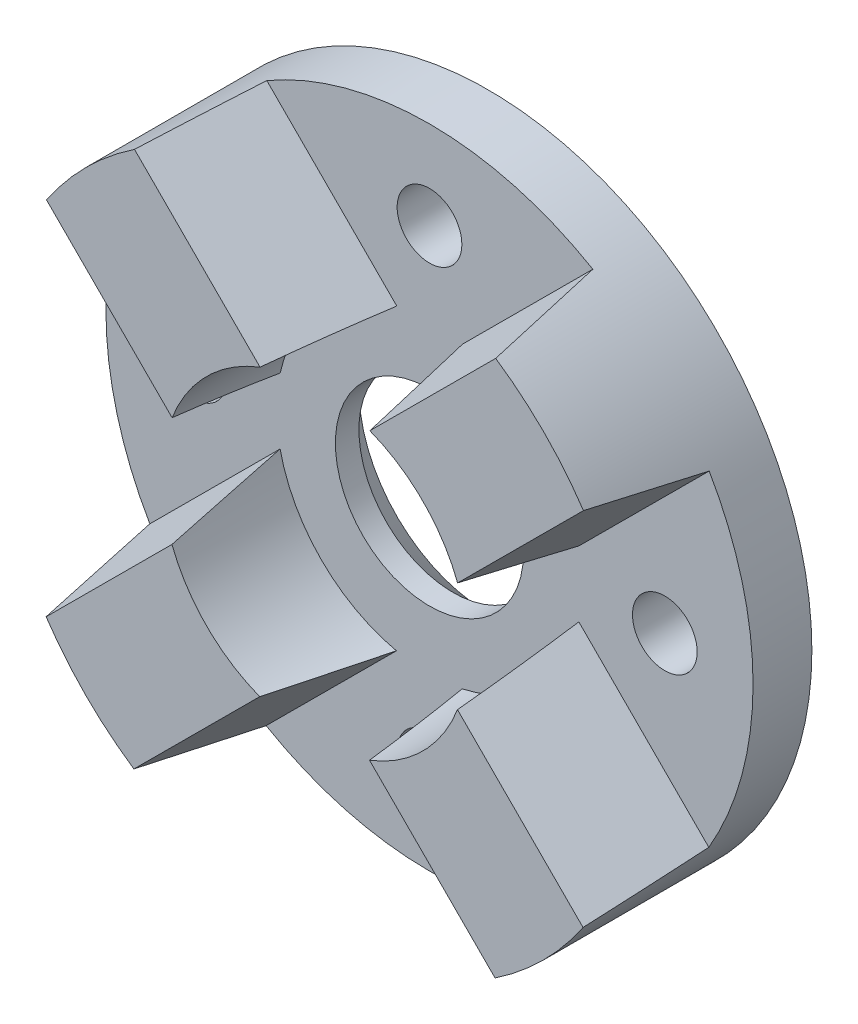
ISO-10303-21;
HEADER;
FILE_DESCRIPTION(('STEP AP214'),'2;1');
FILE_NAME('part.step','',(''),(''),'','','');
FILE_SCHEMA(('AUTOMOTIVE_DESIGN { 1 0 10303 214 1 1 1 1 }'));
ENDSEC;
DATA;
#1=APPLICATION_CONTEXT('core data for automotive mechanical design processes');
#2=APPLICATION_PROTOCOL_DEFINITION('international standard','automotive_design',2000,#1);
#3=PRODUCT_CONTEXT('',#1,'mechanical');
#4=PRODUCT('Part','Part','',(#3));
#5=PRODUCT_RELATED_PRODUCT_CATEGORY('part','',(#4));
#6=PRODUCT_DEFINITION_FORMATION('','',#4);
#7=PRODUCT_DEFINITION_CONTEXT('part definition',#1,'design');
#8=PRODUCT_DEFINITION('design','',#6,#7);
#9=PRODUCT_DEFINITION_SHAPE('','',#8);
#10=(LENGTH_UNIT() NAMED_UNIT(*) SI_UNIT(.MILLI.,.METRE.));
#11=(NAMED_UNIT(*) PLANE_ANGLE_UNIT() SI_UNIT($,.RADIAN.));
#12=(NAMED_UNIT(*) SI_UNIT($,.STERADIAN.) SOLID_ANGLE_UNIT());
#13=UNCERTAINTY_MEASURE_WITH_UNIT(LENGTH_MEASURE(1.E-05),#10,'distance_accuracy_value','');
#14=(GEOMETRIC_REPRESENTATION_CONTEXT(3) GLOBAL_UNCERTAINTY_ASSIGNED_CONTEXT((#13)) GLOBAL_UNIT_ASSIGNED_CONTEXT((#10,
#11,#12)) REPRESENTATION_CONTEXT('',''));
#15=CARTESIAN_POINT('',(0.,0.,0.));
#16=DIRECTION('',(0.,0.,1.));
#17=DIRECTION('',(1.,0.,0.));
#18=AXIS2_PLACEMENT_3D('',#15,#16,#17);
#19=CARTESIAN_POINT('',(0.,0.,2.));
#20=DIRECTION('',(0.,0.,1.));
#21=DIRECTION('',(1.,0.,0.));
#22=AXIS2_PLACEMENT_3D('',#19,#20,#21);
#23=PLANE('',#22);
#24=CARTESIAN_POINT('',(0.,-8.,2.));
#25=DIRECTION('',(0.,0.,1.));
#26=DIRECTION('',(1.,0.,0.));
#27=AXIS2_PLACEMENT_3D('',#24,#25,#26);
#28=CIRCLE('',#27,1.1);
#29=CARTESIAN_POINT('',(1.09999999999994,-8.,2.));
#30=VERTEX_POINT('',#29);
#31=EDGE_CURVE('E370',#30,#30,#28,.T.);
#32=ORIENTED_EDGE('',*,*,#31,.F.);
#33=EDGE_LOOP('',(#32));
#34=FACE_BOUND('',#33,.T.);
#35=CARTESIAN_POINT('',(0.,0.,2.));
#36=DIRECTION('',(0.,0.,1.));
#37=DIRECTION('',(1.,0.,0.));
#38=AXIS2_PLACEMENT_3D('',#35,#36,#37);
#39=CIRCLE('',#38,3.2);
#40=CARTESIAN_POINT('',(3.2,0.,2.));
#41=VERTEX_POINT('',#40);
#42=EDGE_CURVE('E382',#41,#41,#39,.T.);
#43=ORIENTED_EDGE('',*,*,#42,.F.);
#44=EDGE_LOOP('',(#43));
#45=FACE_BOUND('',#44,.T.);
#46=CARTESIAN_POINT('',(0.,8.,2.));
#47=DIRECTION('',(0.,0.,1.));
#48=DIRECTION('',(1.,0.,0.));
#49=AXIS2_PLACEMENT_3D('',#46,#47,#48);
#50=CIRCLE('',#49,1.1);
#51=CARTESIAN_POINT('',(1.1,8.,2.));
#52=VERTEX_POINT('',#51);
#53=EDGE_CURVE('E212',#52,#52,#50,.T.);
#54=ORIENTED_EDGE('',*,*,#53,.F.);
#55=EDGE_LOOP('',(#54));
#56=FACE_BOUND('',#55,.T.);
#57=CARTESIAN_POINT('',(8.,0.,2.));
#58=DIRECTION('',(0.,0.,1.));
#59=DIRECTION('',(1.,0.,0.));
#60=AXIS2_PLACEMENT_3D('',#57,#58,#59);
#61=CIRCLE('',#60,1.1);
#62=CARTESIAN_POINT('',(9.1,0.,2.));
#63=VERTEX_POINT('',#62);
#64=EDGE_CURVE('E378',#63,#63,#61,.T.);
#65=ORIENTED_EDGE('',*,*,#64,.F.);
#66=EDGE_LOOP('',(#65));
#67=FACE_BOUND('',#66,.T.);
#68=CARTESIAN_POINT('',(-8.,0.,2.));
#69=DIRECTION('',(0.,0.,1.));
#70=DIRECTION('',(1.,0.,0.));
#71=AXIS2_PLACEMENT_3D('',#68,#69,#70);
#72=CIRCLE('',#71,1.1);
#73=CARTESIAN_POINT('',(-6.9,0.,2.));
#74=VERTEX_POINT('',#73);
#75=EDGE_CURVE('E362',#74,#74,#72,.T.);
#76=ORIENTED_EDGE('',*,*,#75,.F.);
#77=EDGE_LOOP('',(#76));
#78=FACE_BOUND('',#77,.T.);
#79=CARTESIAN_POINT('',(0.,0.,2.));
#80=DIRECTION('',(0.,0.,1.));
#81=DIRECTION('',(0.,1.,0.));
#82=AXIS2_PLACEMENT_3D('',#79,#80,#81);
#83=CIRCLE('',#82,5.2);
#84=CARTESIAN_POINT('',(1.11263935365737,-5.07957022480179,2.));
#85=VERTEX_POINT('',#84);
#86=CARTESIAN_POINT('',(5.07699437032677,-1.1243345425941,2.));
#87=VERTEX_POINT('',#86);
#88=EDGE_CURVE('E85',#85,#87,#83,.T.);
#89=ORIENTED_EDGE('',*,*,#88,.T.);
#90=DIRECTION('',(0.706292086108507,-0.707920538690956,0.));
#91=VECTOR('',#90,1.);
#92=CARTESIAN_POINT('',(9.62189450409065,-5.67971356250914,2.));
#93=LINE('',#92,#91);
#94=CARTESIAN_POINT('',(9.49547887946232,-5.55300646944383,2.));
#95=VERTEX_POINT('',#94);
#96=EDGE_CURVE('E306',#87,#95,#93,.T.);
#97=ORIENTED_EDGE('',*,*,#96,.T.);
#98=CARTESIAN_POINT('',(0.,0.,2.));
#99=DIRECTION('',(0.,0.,1.));
#100=DIRECTION('',(1.,0.,0.));
#101=AXIS2_PLACEMENT_3D('',#98,#99,#100);
#102=CIRCLE('',#101,11.);
#103=CARTESIAN_POINT('',(9.50824215165146,5.53112386279302,2.));
#104=VERTEX_POINT('',#103);
#105=EDGE_CURVE('E193',#95,#104,#102,.T.);
#106=ORIENTED_EDGE('',*,*,#105,.T.);
#107=DIRECTION('',(-0.707920538690948,-0.706292086108515,0.));
#108=VECTOR('',#107,1.);
#109=CARTESIAN_POINT('',(1.97761784110387,-1.98217750833468,2.));
#110=LINE('',#109,#108);
#111=CARTESIAN_POINT('',(5.07957022480178,1.11263935365743,2.));
#112=VERTEX_POINT('',#111);
#113=EDGE_CURVE('E271',#104,#112,#110,.T.);
#114=ORIENTED_EDGE('',*,*,#113,.T.);
#115=CARTESIAN_POINT('',(0.,0.,2.));
#116=DIRECTION('',(0.,0.,1.));
#117=DIRECTION('',(-1.,0.,0.));
#118=AXIS2_PLACEMENT_3D('',#115,#116,#117);
#119=CIRCLE('',#118,5.2);
#120=CARTESIAN_POINT('',(1.12433454259405,5.07699437032678,2.));
#121=VERTEX_POINT('',#120);
#122=EDGE_CURVE('E339',#112,#121,#119,.T.);
#123=ORIENTED_EDGE('',*,*,#122,.T.);
#124=DIRECTION('',(0.707920538690948,0.706292086108515,0.));
#125=VECTOR('',#124,1.);
#126=CARTESIAN_POINT('',(5.67971356250905,9.62189450409071,2.));
#127=LINE('',#126,#125);
#128=CARTESIAN_POINT('',(5.55300646944374,9.49547887946238,2.));
#129=VERTEX_POINT('',#128);
#130=EDGE_CURVE('E275',#121,#129,#127,.T.);
#131=ORIENTED_EDGE('',*,*,#130,.T.);
#132=CARTESIAN_POINT('',(-5.53112386279299,9.50824215165148,2.));
#133=VERTEX_POINT('',#132);
#134=EDGE_CURVE('E201',#129,#133,#102,.T.);
#135=ORIENTED_EDGE('',*,*,#134,.T.);
#136=DIRECTION('',(0.706292086108512,-0.707920538690951,0.));
#137=VECTOR('',#136,1.);
#138=CARTESIAN_POINT('',(1.98217750833469,1.97761784110386,2.));
#139=LINE('',#138,#137);
#140=CARTESIAN_POINT('',(-1.11263935365741,5.07957022480178,2.));
#141=VERTEX_POINT('',#140);
#142=EDGE_CURVE('E240',#133,#141,#139,.T.);
#143=ORIENTED_EDGE('',*,*,#142,.T.);
#144=CARTESIAN_POINT('',(0.,0.,2.));
#145=DIRECTION('',(0.,0.,1.));
#146=DIRECTION('',(0.,-1.,0.));
#147=AXIS2_PLACEMENT_3D('',#144,#145,#146);
#148=CIRCLE('',#147,5.2);
#149=CARTESIAN_POINT('',(-5.07699437032678,1.12433454259407,2.));
#150=VERTEX_POINT('',#149);
#151=EDGE_CURVE('E342',#141,#150,#148,.T.);
#152=ORIENTED_EDGE('',*,*,#151,.T.);
#153=DIRECTION('',(-0.706292086108512,0.707920538690951,0.));
#154=VECTOR('',#153,1.);
#155=CARTESIAN_POINT('',(-9.62189450409069,5.67971356250908,2.));
#156=LINE('',#155,#154);
#157=CARTESIAN_POINT('',(-9.49547887946236,5.55300646944377,2.));
#158=VERTEX_POINT('',#157);
#159=EDGE_CURVE('E244',#150,#158,#156,.T.);
#160=ORIENTED_EDGE('',*,*,#159,.T.);
#161=CARTESIAN_POINT('',(-9.50824215165146,-5.53112386279302,2.));
#162=VERTEX_POINT('',#161);
#163=EDGE_CURVE('E195',#158,#162,#102,.T.);
#164=ORIENTED_EDGE('',*,*,#163,.T.);
#165=DIRECTION('',(0.707920538690948,0.706292086108515,0.));
#166=VECTOR('',#165,1.);
#167=CARTESIAN_POINT('',(-1.97761784110387,1.98217750833468,2.));
#168=LINE('',#167,#166);
#169=CARTESIAN_POINT('',(-5.07957022480178,-1.11263935365743,2.));
#170=VERTEX_POINT('',#169);
#171=EDGE_CURVE('E186',#162,#170,#168,.T.);
#172=ORIENTED_EDGE('',*,*,#171,.T.);
#173=CARTESIAN_POINT('',(0.,0.,2.));
#174=DIRECTION('',(0.,0.,1.));
#175=DIRECTION('',(1.,0.,0.));
#176=AXIS2_PLACEMENT_3D('',#173,#174,#175);
#177=CIRCLE('',#176,5.2);
#178=CARTESIAN_POINT('',(-1.12433454259405,-5.07699437032678,2.));
#179=VERTEX_POINT('',#178);
#180=EDGE_CURVE('E183',#170,#179,#177,.T.);
#181=ORIENTED_EDGE('',*,*,#180,.T.);
#182=DIRECTION('',(-0.707920538690948,-0.706292086108515,0.));
#183=VECTOR('',#182,1.);
#184=CARTESIAN_POINT('',(-5.67971356250905,-9.62189450409071,2.));
#185=LINE('',#184,#183);
#186=CARTESIAN_POINT('',(-5.55300646944374,-9.49547887946238,2.));
#187=VERTEX_POINT('',#186);
#188=EDGE_CURVE('E173',#179,#187,#185,.T.);
#189=ORIENTED_EDGE('',*,*,#188,.T.);
#190=CARTESIAN_POINT('',(5.53112386279292,-9.50824215165152,2.));
#191=VERTEX_POINT('',#190);
#192=EDGE_CURVE('E180',#187,#191,#102,.T.);
#193=ORIENTED_EDGE('',*,*,#192,.T.);
#194=DIRECTION('',(-0.706292086108507,0.707920538690956,0.));
#195=VECTOR('',#194,1.);
#196=CARTESIAN_POINT('',(-1.9821775083347,-1.97761784110384,2.));
#197=LINE('',#196,#195);
#198=EDGE_CURVE('E303',#191,#85,#197,.T.);
#199=ORIENTED_EDGE('',*,*,#198,.T.);
#200=EDGE_LOOP('',(#89,#97,#106,#114,#123,#131,#135,#143,#152,#160,#164,#172,#181,#189,#193,#199));
#201=FACE_BOUND('',#200,.T.);
#202=ADVANCED_FACE('F49',(#34,#45,#56,#67,#78,#201),#23,.T.);
#203=CARTESIAN_POINT('',(0.,0.,0.));
#204=DIRECTION('',(0.,0.,1.));
#205=DIRECTION('',(1.,0.,0.));
#206=AXIS2_PLACEMENT_3D('',#203,#204,#205);
#207=PLANE('',#206);
#208=CARTESIAN_POINT('',(0.,0.,0.));
#209=DIRECTION('',(0.,0.,1.));
#210=DIRECTION('',(1.,0.,0.));
#211=AXIS2_PLACEMENT_3D('',#208,#209,#210);
#212=CIRCLE('',#211,4.4);
#213=CARTESIAN_POINT('',(4.4,0.,0.));
#214=VERTEX_POINT('',#213);
#215=EDGE_CURVE('E192',#214,#214,#212,.T.);
#216=ORIENTED_EDGE('',*,*,#215,.T.);
#217=EDGE_LOOP('',(#216));
#218=FACE_BOUND('',#217,.T.);
#219=CARTESIAN_POINT('',(0.,0.,0.));
#220=DIRECTION('',(0.,0.,1.));
#221=DIRECTION('',(1.,0.,0.));
#222=AXIS2_PLACEMENT_3D('',#219,#220,#221);
#223=CIRCLE('',#222,11.);
#224=CARTESIAN_POINT('',(11.,0.,0.));
#225=VERTEX_POINT('',#224);
#226=EDGE_CURVE('E205',#225,#225,#223,.T.);
#227=ORIENTED_EDGE('',*,*,#226,.F.);
#228=EDGE_LOOP('',(#227));
#229=FACE_BOUND('',#228,.T.);
#230=CARTESIAN_POINT('',(0.,8.,0.));
#231=DIRECTION('',(0.,0.,1.));
#232=DIRECTION('',(1.,0.,0.));
#233=AXIS2_PLACEMENT_3D('',#230,#231,#232);
#234=CIRCLE('',#233,1.1);
#235=CARTESIAN_POINT('',(1.1,8.,0.));
#236=VERTEX_POINT('',#235);
#237=EDGE_CURVE('E216',#236,#236,#234,.T.);
#238=ORIENTED_EDGE('',*,*,#237,.T.);
#239=EDGE_LOOP('',(#238));
#240=FACE_BOUND('',#239,.T.);
#241=CARTESIAN_POINT('',(8.,0.,0.));
#242=DIRECTION('',(0.,0.,1.));
#243=DIRECTION('',(1.,0.,0.));
#244=AXIS2_PLACEMENT_3D('',#241,#242,#243);
#245=CIRCLE('',#244,1.1);
#246=CARTESIAN_POINT('',(9.1,0.,0.));
#247=VERTEX_POINT('',#246);
#248=EDGE_CURVE('E374',#247,#247,#245,.T.);
#249=ORIENTED_EDGE('',*,*,#248,.T.);
#250=EDGE_LOOP('',(#249));
#251=FACE_BOUND('',#250,.T.);
#252=CARTESIAN_POINT('',(0.,-8.,0.));
#253=DIRECTION('',(0.,0.,1.));
#254=DIRECTION('',(1.,0.,0.));
#255=AXIS2_PLACEMENT_3D('',#252,#253,#254);
#256=CIRCLE('',#255,1.1);
#257=CARTESIAN_POINT('',(1.09999999999994,-8.,0.));
#258=VERTEX_POINT('',#257);
#259=EDGE_CURVE('E366',#258,#258,#256,.T.);
#260=ORIENTED_EDGE('',*,*,#259,.T.);
#261=EDGE_LOOP('',(#260));
#262=FACE_BOUND('',#261,.T.);
#263=CARTESIAN_POINT('',(-8.,0.,0.));
#264=DIRECTION('',(0.,0.,1.));
#265=DIRECTION('',(1.,0.,0.));
#266=AXIS2_PLACEMENT_3D('',#263,#264,#265);
#267=CIRCLE('',#266,1.1);
#268=CARTESIAN_POINT('',(-6.9,0.,0.));
#269=VERTEX_POINT('',#268);
#270=EDGE_CURVE('E359',#269,#269,#267,.T.);
#271=ORIENTED_EDGE('',*,*,#270,.T.);
#272=EDGE_LOOP('',(#271));
#273=FACE_BOUND('',#272,.T.);
#274=ADVANCED_FACE('F392',(#218,#229,#240,#251,#262,#273),#207,.F.);
#275=CARTESIAN_POINT('',(0.,0.,2.));
#276=DIRECTION('',(0.,0.,-1.));
#277=DIRECTION('',(-1.,0.,0.));
#278=AXIS2_PLACEMENT_3D('',#275,#276,#277);
#279=CYLINDRICAL_SURFACE('',#278,11.);
#280=ORIENTED_EDGE('',*,*,#192,.F.);
#281=CARTESIAN_POINT('',(0.,0.,17.87958909493));
#282=DIRECTION('',(0.695561922290832,-0.697165635019425,0.173648177666928));
#283=DIRECTION('',(0.122646333653316,-0.122929111476673,-0.984807753012209));
#284=AXIS2_PLACEMENT_3D('',#281,#282,#283);
#285=ELLIPSE('',#284,63.346475314581,11.);
#286=CARTESIAN_POINT('',(-6.15028261222851,-9.11997937441306,5.9));
#287=VERTEX_POINT('',#286);
#288=EDGE_CURVE('E169',#187,#287,#285,.F.);
#289=ORIENTED_EDGE('',*,*,#288,.T.);
#290=CARTESIAN_POINT('',(0.,0.,5.9));
#291=DIRECTION('',(0.,0.,1.));
#292=DIRECTION('',(1.,0.,0.));
#293=AXIS2_PLACEMENT_3D('',#290,#291,#292);
#294=CIRCLE('',#293,11.);
#295=CARTESIAN_POINT('',(-9.13411915631024,-6.12926318886099,5.9));
#296=VERTEX_POINT('',#295);
#297=EDGE_CURVE('E356',#296,#287,#294,.T.);
#298=ORIENTED_EDGE('',*,*,#297,.F.);
#299=CARTESIAN_POINT('',(0.,0.,17.8795890949301));
#300=DIRECTION('',(0.695561922290832,-0.697165635019425,-0.173648177666927));
#301=DIRECTION('',(-0.122646333653316,0.122929111476673,-0.984807753012209));
#302=AXIS2_PLACEMENT_3D('',#299,#300,#301);
#303=ELLIPSE('',#302,63.3464753145811,11.);
#304=EDGE_CURVE('E233',#296,#162,#303,.T.);
#305=ORIENTED_EDGE('',*,*,#304,.T.);
#306=ORIENTED_EDGE('',*,*,#163,.F.);
#307=CARTESIAN_POINT('',(0.,0.,17.87958909493));
#308=DIRECTION('',(-0.697165635019427,-0.695561922290829,0.173648177666928));
#309=DIRECTION('',(-0.122929111476673,-0.122646333653316,-0.984807753012209));
#310=AXIS2_PLACEMENT_3D('',#307,#308,#309);
#311=ELLIPSE('',#310,63.346475314581,11.);
#312=CARTESIAN_POINT('',(-9.11997937441304,6.15028261222854,5.9));
#313=VERTEX_POINT('',#312);
#314=EDGE_CURVE('E247',#158,#313,#311,.F.);
#315=ORIENTED_EDGE('',*,*,#314,.T.);
#316=CARTESIAN_POINT('',(0.,0.,5.9));
#317=DIRECTION('',(0.,0.,1.));
#318=DIRECTION('',(0.,-1.,0.));
#319=AXIS2_PLACEMENT_3D('',#316,#317,#318);
#320=CIRCLE('',#319,11.);
#321=CARTESIAN_POINT('',(-6.12926318886096,9.13411915631026,5.9));
#322=VERTEX_POINT('',#321);
#323=EDGE_CURVE('E348',#322,#313,#320,.T.);
#324=ORIENTED_EDGE('',*,*,#323,.F.);
#325=CARTESIAN_POINT('',(0.,0.,17.8795890949301));
#326=DIRECTION('',(-0.697165635019427,-0.695561922290829,-0.173648177666927));
#327=DIRECTION('',(0.122929111476673,0.122646333653316,-0.984807753012209));
#328=AXIS2_PLACEMENT_3D('',#325,#326,#327);
#329=ELLIPSE('',#328,63.3464753145811,11.);
#330=EDGE_CURVE('E263',#322,#133,#329,.T.);
#331=ORIENTED_EDGE('',*,*,#330,.T.);
#332=ORIENTED_EDGE('',*,*,#134,.F.);
#333=CARTESIAN_POINT('',(0.,0.,17.87958909493));
#334=DIRECTION('',(-0.695561922290832,0.697165635019425,0.173648177666928));
#335=DIRECTION('',(-0.122646333653316,0.122929111476673,-0.984807753012209));
#336=AXIS2_PLACEMENT_3D('',#333,#334,#335);
#337=ELLIPSE('',#336,63.346475314581,11.);
#338=CARTESIAN_POINT('',(6.15028261222851,9.11997937441306,5.9));
#339=VERTEX_POINT('',#338);
#340=EDGE_CURVE('E279',#129,#339,#337,.F.);
#341=ORIENTED_EDGE('',*,*,#340,.T.);
#342=CARTESIAN_POINT('',(0.,0.,5.9));
#343=DIRECTION('',(0.,0.,1.));
#344=DIRECTION('',(-1.,0.,0.));
#345=AXIS2_PLACEMENT_3D('',#342,#343,#344);
#346=CIRCLE('',#345,11.);
#347=CARTESIAN_POINT('',(9.13411915631024,6.12926318886099,5.9));
#348=VERTEX_POINT('',#347);
#349=EDGE_CURVE('E338',#348,#339,#346,.T.);
#350=ORIENTED_EDGE('',*,*,#349,.F.);
#351=CARTESIAN_POINT('',(0.,0.,17.8795890949301));
#352=DIRECTION('',(-0.695561922290832,0.697165635019425,-0.173648177666927));
#353=DIRECTION('',(0.122646333653316,-0.122929111476673,-0.984807753012209));
#354=AXIS2_PLACEMENT_3D('',#351,#352,#353);
#355=ELLIPSE('',#354,63.3464753145811,11.);
#356=EDGE_CURVE('E295',#348,#104,#355,.T.);
#357=ORIENTED_EDGE('',*,*,#356,.T.);
#358=ORIENTED_EDGE('',*,*,#105,.F.);
#359=CARTESIAN_POINT('',(0.,0.,17.87958909493));
#360=DIRECTION('',(0.697165635019432,0.695561922290824,0.173648177666928));
#361=DIRECTION('',(0.122929111476674,0.122646333653315,-0.984807753012209));
#362=AXIS2_PLACEMENT_3D('',#359,#360,#361);
#363=ELLIPSE('',#362,63.346475314581,11.);
#364=CARTESIAN_POINT('',(9.119979374413,-6.15028261222861,5.9));
#365=VERTEX_POINT('',#364);
#366=EDGE_CURVE('E309',#95,#365,#363,.F.);
#367=ORIENTED_EDGE('',*,*,#366,.T.);
#368=CARTESIAN_POINT('',(0.,0.,5.9));
#369=DIRECTION('',(0.,0.,1.));
#370=DIRECTION('',(0.,1.,0.));
#371=AXIS2_PLACEMENT_3D('',#368,#369,#370);
#372=CIRCLE('',#371,11.);
#373=CARTESIAN_POINT('',(6.1292631888609,-9.1341191563103,5.9));
#374=VERTEX_POINT('',#373);
#375=EDGE_CURVE('E74',#374,#365,#372,.T.);
#376=ORIENTED_EDGE('',*,*,#375,.F.);
#377=CARTESIAN_POINT('',(0.,0.,17.8795890949301));
#378=DIRECTION('',(0.697165635019432,0.695561922290825,-0.173648177666927));
#379=DIRECTION('',(-0.122929111476674,-0.122646333653315,-0.984807753012209));
#380=AXIS2_PLACEMENT_3D('',#377,#378,#379);
#381=ELLIPSE('',#380,63.3464753145811,11.);
#382=EDGE_CURVE('E59',#374,#191,#381,.T.);
#383=ORIENTED_EDGE('',*,*,#382,.T.);
#384=EDGE_LOOP('',(#280,#289,#298,#305,#306,#315,#324,#331,#332,#341,#350,#357,#358,#367,#376,#383));
#385=FACE_BOUND('',#384,.T.);
#386=ORIENTED_EDGE('',*,*,#226,.T.);
#387=EDGE_LOOP('',(#386));
#388=FACE_BOUND('',#387,.T.);
#389=ADVANCED_FACE('F188',(#385,#388),#279,.T.);
#390=CARTESIAN_POINT('',(0.,8.,2.));
#391=DIRECTION('',(0.,0.,-1.));
#392=DIRECTION('',(-1.,0.,0.));
#393=AXIS2_PLACEMENT_3D('',#390,#391,#392);
#394=CYLINDRICAL_SURFACE('',#393,1.1);
#395=ORIENTED_EDGE('',*,*,#53,.T.);
#396=EDGE_LOOP('',(#395));
#397=FACE_BOUND('',#396,.T.);
#398=ORIENTED_EDGE('',*,*,#237,.F.);
#399=EDGE_LOOP('',(#398));
#400=FACE_BOUND('',#399,.T.);
#401=ADVANCED_FACE('F395',(#397,#400),#394,.F.);
#402=CARTESIAN_POINT('',(0.,0.,2.));
#403=DIRECTION('',(0.,0.,-1.));
#404=DIRECTION('',(-1.,0.,0.));
#405=AXIS2_PLACEMENT_3D('',#402,#403,#404);
#406=CYLINDRICAL_SURFACE('',#405,3.2);
#407=CARTESIAN_POINT('',(0.,0.,1.2));
#408=DIRECTION('',(0.,0.,1.));
#409=DIRECTION('',(1.,0.,0.));
#410=AXIS2_PLACEMENT_3D('',#407,#408,#409);
#411=CIRCLE('',#410,3.2);
#412=CARTESIAN_POINT('',(3.2,0.,1.2));
#413=VERTEX_POINT('',#412);
#414=EDGE_CURVE('E199',#413,#413,#411,.F.);
#415=ORIENTED_EDGE('',*,*,#414,.T.);
#416=EDGE_LOOP('',(#415));
#417=FACE_BOUND('',#416,.T.);
#418=ORIENTED_EDGE('',*,*,#42,.T.);
#419=EDGE_LOOP('',(#418));
#420=FACE_BOUND('',#419,.T.);
#421=ADVANCED_FACE('F397',(#417,#420),#406,.F.);
#422=CARTESIAN_POINT('',(8.,0.,2.));
#423=DIRECTION('',(0.,0.,-1.));
#424=DIRECTION('',(-1.,0.,0.));
#425=AXIS2_PLACEMENT_3D('',#422,#423,#424);
#426=CYLINDRICAL_SURFACE('',#425,1.1);
#427=ORIENTED_EDGE('',*,*,#64,.T.);
#428=EDGE_LOOP('',(#427));
#429=FACE_BOUND('',#428,.T.);
#430=ORIENTED_EDGE('',*,*,#248,.F.);
#431=EDGE_LOOP('',(#430));
#432=FACE_BOUND('',#431,.T.);
#433=ADVANCED_FACE('F404',(#429,#432),#426,.F.);
#434=CARTESIAN_POINT('',(0.,-8.,2.));
#435=DIRECTION('',(0.,0.,-1.));
#436=DIRECTION('',(-1.,0.,0.));
#437=AXIS2_PLACEMENT_3D('',#434,#435,#436);
#438=CYLINDRICAL_SURFACE('',#437,1.1);
#439=ORIENTED_EDGE('',*,*,#31,.T.);
#440=EDGE_LOOP('',(#439));
#441=FACE_BOUND('',#440,.T.);
#442=ORIENTED_EDGE('',*,*,#259,.F.);
#443=EDGE_LOOP('',(#442));
#444=FACE_BOUND('',#443,.T.);
#445=ADVANCED_FACE('F516',(#441,#444),#438,.F.);
#446=CARTESIAN_POINT('',(-8.,0.,2.));
#447=DIRECTION('',(0.,0.,-1.));
#448=DIRECTION('',(-1.,0.,0.));
#449=AXIS2_PLACEMENT_3D('',#446,#447,#448);
#450=CYLINDRICAL_SURFACE('',#449,1.1);
#451=ORIENTED_EDGE('',*,*,#75,.T.);
#452=EDGE_LOOP('',(#451));
#453=FACE_BOUND('',#452,.T.);
#454=ORIENTED_EDGE('',*,*,#270,.F.);
#455=EDGE_LOOP('',(#454));
#456=FACE_BOUND('',#455,.T.);
#457=ADVANCED_FACE('F429',(#453,#456),#450,.F.);
#458=CARTESIAN_POINT('',(0.,0.,0.));
#459=DIRECTION('',(0.,0.,-1.));
#460=DIRECTION('',(-1.,0.,0.));
#461=AXIS2_PLACEMENT_3D('',#458,#459,#460);
#462=CONICAL_SURFACE('',#461,4.4,0.785398163397448);
#463=ORIENTED_EDGE('',*,*,#414,.F.);
#464=EDGE_LOOP('',(#463));
#465=FACE_BOUND('',#464,.T.);
#466=ORIENTED_EDGE('',*,*,#215,.F.);
#467=EDGE_LOOP('',(#466));
#468=FACE_BOUND('',#467,.T.);
#469=ADVANCED_FACE('F422',(#465,#468),#462,.F.);
#470=CARTESIAN_POINT('',(0.,0.,5.9));
#471=DIRECTION('',(0.,0.,-1.));
#472=DIRECTION('',(-1.,0.,0.));
#473=AXIS2_PLACEMENT_3D('',#470,#471,#472);
#474=CYLINDRICAL_SURFACE('',#473,5.2);
#475=ORIENTED_EDGE('',*,*,#180,.F.);
#476=CARTESIAN_POINT('',(0.,0.,17.8795890949301));
#477=DIRECTION('',(0.695561922290832,-0.697165635019425,-0.173648177666927));
#478=DIRECTION('',(-0.122646333653316,0.122929111476673,-0.984807753012209));
#479=AXIS2_PLACEMENT_3D('',#476,#477,#478);
#480=ELLIPSE('',#479,29.9456065123474,5.2);
#481=CARTESIAN_POINT('',(-4.85570192139263,-1.86068773591486,5.9));
#482=VERTEX_POINT('',#481);
#483=EDGE_CURVE('E236',#170,#482,#480,.F.);
#484=ORIENTED_EDGE('',*,*,#483,.T.);
#485=CARTESIAN_POINT('',(0.,0.,5.9));
#486=DIRECTION('',(0.,0.,1.));
#487=DIRECTION('',(1.,0.,0.));
#488=AXIS2_PLACEMENT_3D('',#485,#486,#487);
#489=CIRCLE('',#488,5.2);
#490=CARTESIAN_POINT('',(-1.8718653773109,-4.85140392146693,5.9));
#491=VERTEX_POINT('',#490);
#492=EDGE_CURVE('E353',#482,#491,#489,.T.);
#493=ORIENTED_EDGE('',*,*,#492,.T.);
#494=CARTESIAN_POINT('',(0.,0.,17.87958909493));
#495=DIRECTION('',(0.695561922290832,-0.697165635019425,0.173648177666928));
#496=DIRECTION('',(0.122646333653316,-0.122929111476673,-0.984807753012209));
#497=AXIS2_PLACEMENT_3D('',#494,#495,#496);
#498=ELLIPSE('',#497,29.9456065123474,5.2);
#499=EDGE_CURVE('E226',#491,#179,#498,.T.);
#500=ORIENTED_EDGE('',*,*,#499,.T.);
#501=EDGE_LOOP('',(#475,#484,#493,#500));
#502=FACE_BOUND('',#501,.T.);
#503=ADVANCED_FACE('F428',(#502),#474,.F.);
#504=CARTESIAN_POINT('',(0.,0.,5.9));
#505=DIRECTION('',(0.,0.,1.));
#506=DIRECTION('',(1.,0.,0.));
#507=AXIS2_PLACEMENT_3D('',#504,#505,#506);
#508=PLANE('',#507);
#509=ORIENTED_EDGE('',*,*,#492,.F.);
#510=DIRECTION('',(-0.707920538690948,-0.706292086108515,0.));
#511=VECTOR('',#510,1.);
#512=CARTESIAN_POINT('',(-1.49191827204086,1.49535809277604,5.9));
#513=LINE('',#512,#511);
#514=EDGE_CURVE('E229',#482,#296,#513,.T.);
#515=ORIENTED_EDGE('',*,*,#514,.T.);
#516=ORIENTED_EDGE('',*,*,#297,.T.);
#517=DIRECTION('',(-0.707920538690948,-0.706292086108515,0.));
#518=VECTOR('',#517,1.);
#519=CARTESIAN_POINT('',(1.49191827204086,-1.49535809277603,5.9));
#520=LINE('',#519,#518);
#521=EDGE_CURVE('E175',#287,#491,#520,.F.);
#522=ORIENTED_EDGE('',*,*,#521,.T.);
#523=EDGE_LOOP('',(#509,#515,#516,#522));
#524=FACE_BOUND('',#523,.T.);
#525=ADVANCED_FACE('F437',(#524),#508,.T.);
#526=CARTESIAN_POINT('',(1.97761784110386,-1.98217750833468,2.));
#527=DIRECTION('',(0.695561922290832,-0.697165635019425,0.173648177666928));
#528=DIRECTION('',(0.707920538690948,0.706292086108515,0.));
#529=AXIS2_PLACEMENT_3D('',#526,#527,#528);
#530=PLANE('',#529);
#531=ORIENTED_EDGE('',*,*,#499,.F.);
#532=ORIENTED_EDGE('',*,*,#521,.F.);
#533=ORIENTED_EDGE('',*,*,#288,.F.);
#534=ORIENTED_EDGE('',*,*,#188,.F.);
#535=EDGE_LOOP('',(#531,#532,#533,#534));
#536=FACE_BOUND('',#535,.T.);
#537=ADVANCED_FACE('F172',(#536),#530,.T.);
#538=CARTESIAN_POINT('',(-1.41258417221703,1.4158410773819,6.53702545569443));
#539=DIRECTION('',(0.695561922290832,-0.697165635019425,-0.173648177666927));
#540=DIRECTION('',(-0.707920538690948,-0.706292086108515,0.));
#541=AXIS2_PLACEMENT_3D('',#538,#539,#540);
#542=PLANE('',#541);
#543=ORIENTED_EDGE('',*,*,#483,.F.);
#544=ORIENTED_EDGE('',*,*,#171,.F.);
#545=ORIENTED_EDGE('',*,*,#304,.F.);
#546=ORIENTED_EDGE('',*,*,#514,.F.);
#547=EDGE_LOOP('',(#543,#544,#545,#546));
#548=FACE_BOUND('',#547,.T.);
#549=ADVANCED_FACE('F436',(#548),#542,.F.);
#550=CARTESIAN_POINT('',(0.,0.,5.9));
#551=DIRECTION('',(0.,0.,-1.));
#552=DIRECTION('',(-1.,0.,0.));
#553=AXIS2_PLACEMENT_3D('',#550,#551,#552);
#554=CYLINDRICAL_SURFACE('',#553,5.2);
#555=ORIENTED_EDGE('',*,*,#151,.F.);
#556=CARTESIAN_POINT('',(0.,0.,17.8795890949301));
#557=DIRECTION('',(-0.697165635019427,-0.695561922290829,-0.173648177666927));
#558=DIRECTION('',(0.122929111476673,0.122646333653316,-0.984807753012209));
#559=AXIS2_PLACEMENT_3D('',#556,#557,#558);
#560=ELLIPSE('',#559,29.9456065123474,5.2);
#561=CARTESIAN_POINT('',(-1.86068773591484,4.85570192139263,5.9));
#562=VERTEX_POINT('',#561);
#563=EDGE_CURVE('E267',#141,#562,#560,.F.);
#564=ORIENTED_EDGE('',*,*,#563,.T.);
#565=CARTESIAN_POINT('',(0.,0.,5.9));
#566=DIRECTION('',(0.,0.,1.));
#567=DIRECTION('',(0.,-1.,0.));
#568=AXIS2_PLACEMENT_3D('',#565,#566,#567);
#569=CIRCLE('',#568,5.2);
#570=CARTESIAN_POINT('',(-4.85140392146693,1.87186537731092,5.9));
#571=VERTEX_POINT('',#570);
#572=EDGE_CURVE('E345',#562,#571,#569,.T.);
#573=ORIENTED_EDGE('',*,*,#572,.T.);
#574=CARTESIAN_POINT('',(0.,0.,17.87958909493));
#575=DIRECTION('',(-0.697165635019427,-0.695561922290829,0.173648177666928));
#576=DIRECTION('',(-0.122929111476673,-0.122646333653316,-0.984807753012209));
#577=AXIS2_PLACEMENT_3D('',#574,#575,#576);
#578=ELLIPSE('',#577,29.9456065123474,5.2);
#579=EDGE_CURVE('E255',#571,#150,#578,.T.);
#580=ORIENTED_EDGE('',*,*,#579,.T.);
#581=EDGE_LOOP('',(#555,#564,#573,#580));
#582=FACE_BOUND('',#581,.T.);
#583=ADVANCED_FACE('F442',(#582),#554,.F.);
#584=CARTESIAN_POINT('',(0.,0.,5.9));
#585=DIRECTION('',(0.,0.,1.));
#586=DIRECTION('',(0.,-1.,0.));
#587=AXIS2_PLACEMENT_3D('',#584,#585,#586);
#588=PLANE('',#587);
#589=ORIENTED_EDGE('',*,*,#572,.F.);
#590=DIRECTION('',(-0.706292086108512,0.707920538690951,0.));
#591=VECTOR('',#590,1.);
#592=CARTESIAN_POINT('',(1.49535809277604,1.49191827204086,5.9));
#593=LINE('',#592,#591);
#594=EDGE_CURVE('E259',#562,#322,#593,.T.);
#595=ORIENTED_EDGE('',*,*,#594,.T.);
#596=ORIENTED_EDGE('',*,*,#323,.T.);
#597=DIRECTION('',(-0.706292086108512,0.707920538690951,0.));
#598=VECTOR('',#597,1.);
#599=CARTESIAN_POINT('',(-1.49535809277604,-1.49191827204086,5.9));
#600=LINE('',#599,#598);
#601=EDGE_CURVE('E251',#313,#571,#600,.F.);
#602=ORIENTED_EDGE('',*,*,#601,.T.);
#603=EDGE_LOOP('',(#589,#595,#596,#602));
#604=FACE_BOUND('',#603,.T.);
#605=ADVANCED_FACE('F623',(#604),#588,.T.);
#606=CARTESIAN_POINT('',(0.,0.,5.9));
#607=DIRECTION('',(0.,0.,-1.));
#608=DIRECTION('',(-1.,0.,0.));
#609=AXIS2_PLACEMENT_3D('',#606,#607,#608);
#610=CYLINDRICAL_SURFACE('',#609,5.2);
#611=ORIENTED_EDGE('',*,*,#122,.F.);
#612=CARTESIAN_POINT('',(0.,0.,17.8795890949301));
#613=DIRECTION('',(-0.695561922290832,0.697165635019425,-0.173648177666927));
#614=DIRECTION('',(0.122646333653316,-0.122929111476673,-0.984807753012209));
#615=AXIS2_PLACEMENT_3D('',#612,#613,#614);
#616=ELLIPSE('',#615,29.9456065123474,5.2);
#617=CARTESIAN_POINT('',(4.85570192139263,1.86068773591486,5.9));
#618=VERTEX_POINT('',#617);
#619=EDGE_CURVE('E299',#112,#618,#616,.F.);
#620=ORIENTED_EDGE('',*,*,#619,.T.);
#621=CARTESIAN_POINT('',(0.,0.,5.9));
#622=DIRECTION('',(0.,0.,1.));
#623=DIRECTION('',(-1.,0.,0.));
#624=AXIS2_PLACEMENT_3D('',#621,#622,#623);
#625=CIRCLE('',#624,5.2);
#626=CARTESIAN_POINT('',(1.8718653773109,4.85140392146693,5.9));
#627=VERTEX_POINT('',#626);
#628=EDGE_CURVE('E335',#618,#627,#625,.T.);
#629=ORIENTED_EDGE('',*,*,#628,.T.);
#630=CARTESIAN_POINT('',(0.,0.,17.87958909493));
#631=DIRECTION('',(-0.695561922290832,0.697165635019425,0.173648177666928));
#632=DIRECTION('',(-0.122646333653316,0.122929111476673,-0.984807753012209));
#633=AXIS2_PLACEMENT_3D('',#630,#631,#632);
#634=ELLIPSE('',#633,29.9456065123474,5.2);
#635=EDGE_CURVE('E287',#627,#121,#634,.T.);
#636=ORIENTED_EDGE('',*,*,#635,.T.);
#637=EDGE_LOOP('',(#611,#620,#629,#636));
#638=FACE_BOUND('',#637,.T.);
#639=ADVANCED_FACE('F489',(#638),#610,.F.);
#640=CARTESIAN_POINT('',(0.,0.,5.9));
#641=DIRECTION('',(0.,0.,1.));
#642=DIRECTION('',(-1.,0.,0.));
#643=AXIS2_PLACEMENT_3D('',#640,#641,#642);
#644=PLANE('',#643);
#645=ORIENTED_EDGE('',*,*,#628,.F.);
#646=DIRECTION('',(0.707920538690948,0.706292086108515,0.));
#647=VECTOR('',#646,1.);
#648=CARTESIAN_POINT('',(1.49191827204086,-1.49535809277604,5.9));
#649=LINE('',#648,#647);
#650=EDGE_CURVE('E291',#618,#348,#649,.T.);
#651=ORIENTED_EDGE('',*,*,#650,.T.);
#652=ORIENTED_EDGE('',*,*,#349,.T.);
#653=DIRECTION('',(0.707920538690948,0.706292086108515,0.));
#654=VECTOR('',#653,1.);
#655=CARTESIAN_POINT('',(-1.49191827204086,1.49535809277603,5.9));
#656=LINE('',#655,#654);
#657=EDGE_CURVE('E283',#339,#627,#656,.F.);
#658=ORIENTED_EDGE('',*,*,#657,.T.);
#659=EDGE_LOOP('',(#645,#651,#652,#658));
#660=FACE_BOUND('',#659,.T.);
#661=ADVANCED_FACE('F642',(#660),#644,.T.);
#662=CARTESIAN_POINT('',(0.,0.,5.9));
#663=DIRECTION('',(0.,0.,-1.));
#664=DIRECTION('',(-1.,0.,0.));
#665=AXIS2_PLACEMENT_3D('',#662,#663,#664);
#666=CYLINDRICAL_SURFACE('',#665,5.2);
#667=ORIENTED_EDGE('',*,*,#88,.F.);
#668=CARTESIAN_POINT('',(0.,0.,17.8795890949301));
#669=DIRECTION('',(0.697165635019432,0.695561922290825,-0.173648177666927));
#670=DIRECTION('',(-0.122929111476674,-0.122646333653315,-0.984807753012209));
#671=AXIS2_PLACEMENT_3D('',#668,#669,#670);
#672=ELLIPSE('',#671,29.9456065123474,5.2);
#673=CARTESIAN_POINT('',(1.86068773591481,-4.85570192139264,5.9));
#674=VERTEX_POINT('',#673);
#675=EDGE_CURVE('E11',#85,#674,#672,.F.);
#676=ORIENTED_EDGE('',*,*,#675,.T.);
#677=CARTESIAN_POINT('',(0.,0.,5.9));
#678=DIRECTION('',(0.,0.,1.));
#679=DIRECTION('',(0.,1.,0.));
#680=AXIS2_PLACEMENT_3D('',#677,#678,#679);
#681=CIRCLE('',#680,5.2);
#682=CARTESIAN_POINT('',(4.85140392146691,-1.87186537731095,5.9));
#683=VERTEX_POINT('',#682);
#684=EDGE_CURVE('E66',#674,#683,#681,.T.);
#685=ORIENTED_EDGE('',*,*,#684,.T.);
#686=CARTESIAN_POINT('',(0.,0.,17.87958909493));
#687=DIRECTION('',(0.697165635019432,0.695561922290824,0.173648177666928));
#688=DIRECTION('',(0.122929111476674,0.122646333653315,-0.984807753012209));
#689=AXIS2_PLACEMENT_3D('',#686,#687,#688);
#690=ELLIPSE('',#689,29.9456065123474,5.2);
#691=EDGE_CURVE('E315',#683,#87,#690,.T.);
#692=ORIENTED_EDGE('',*,*,#691,.T.);
#693=EDGE_LOOP('',(#667,#676,#685,#692));
#694=FACE_BOUND('',#693,.T.);
#695=ADVANCED_FACE('F326',(#694),#666,.F.);
#696=CARTESIAN_POINT('',(0.,0.,5.9));
#697=DIRECTION('',(0.,0.,1.));
#698=DIRECTION('',(0.,1.,0.));
#699=AXIS2_PLACEMENT_3D('',#696,#697,#698);
#700=PLANE('',#699);
#701=ORIENTED_EDGE('',*,*,#684,.F.);
#702=DIRECTION('',(0.706292086108507,-0.707920538690955,0.));
#703=VECTOR('',#702,1.);
#704=CARTESIAN_POINT('',(-1.49535809277605,-1.49191827204085,5.9));
#705=LINE('',#704,#703);
#706=EDGE_CURVE('E318',#674,#374,#705,.T.);
#707=ORIENTED_EDGE('',*,*,#706,.T.);
#708=ORIENTED_EDGE('',*,*,#375,.T.);
#709=DIRECTION('',(0.706292086108507,-0.707920538690956,0.));
#710=VECTOR('',#709,1.);
#711=CARTESIAN_POINT('',(1.49535809277605,1.49191827204085,5.9));
#712=LINE('',#711,#710);
#713=EDGE_CURVE('E312',#365,#683,#712,.F.);
#714=ORIENTED_EDGE('',*,*,#713,.T.);
#715=EDGE_LOOP('',(#701,#707,#708,#714));
#716=FACE_BOUND('',#715,.T.);
#717=ADVANCED_FACE('F322',(#716),#700,.T.);
#718=CARTESIAN_POINT('',(-1.98217750833468,-1.97761784110386,2.));
#719=DIRECTION('',(-0.697165635019427,-0.695561922290829,0.173648177666928));
#720=DIRECTION('',(0.706292086108512,-0.707920538690951,0.));
#721=AXIS2_PLACEMENT_3D('',#718,#719,#720);
#722=PLANE('',#721);
#723=ORIENTED_EDGE('',*,*,#579,.F.);
#724=ORIENTED_EDGE('',*,*,#601,.F.);
#725=ORIENTED_EDGE('',*,*,#314,.F.);
#726=ORIENTED_EDGE('',*,*,#159,.F.);
#727=EDGE_LOOP('',(#723,#724,#725,#726));
#728=FACE_BOUND('',#727,.T.);
#729=ADVANCED_FACE('F444',(#728),#722,.T.);
#730=CARTESIAN_POINT('',(1.4158410773819,1.41258417221703,6.53702545569443));
#731=DIRECTION('',(-0.697165635019427,-0.695561922290829,-0.173648177666927));
#732=DIRECTION('',(-0.706292086108513,0.707920538690951,0.));
#733=AXIS2_PLACEMENT_3D('',#730,#731,#732);
#734=PLANE('',#733);
#735=ORIENTED_EDGE('',*,*,#563,.F.);
#736=ORIENTED_EDGE('',*,*,#142,.F.);
#737=ORIENTED_EDGE('',*,*,#330,.F.);
#738=ORIENTED_EDGE('',*,*,#594,.F.);
#739=EDGE_LOOP('',(#735,#736,#737,#738));
#740=FACE_BOUND('',#739,.T.);
#741=ADVANCED_FACE('F450',(#740),#734,.F.);
#742=CARTESIAN_POINT('',(-1.97761784110386,1.98217750833468,2.));
#743=DIRECTION('',(-0.695561922290832,0.697165635019425,0.173648177666928));
#744=DIRECTION('',(-0.707920538690948,-0.706292086108515,0.));
#745=AXIS2_PLACEMENT_3D('',#742,#743,#744);
#746=PLANE('',#745);
#747=ORIENTED_EDGE('',*,*,#635,.F.);
#748=ORIENTED_EDGE('',*,*,#657,.F.);
#749=ORIENTED_EDGE('',*,*,#340,.F.);
#750=ORIENTED_EDGE('',*,*,#130,.F.);
#751=EDGE_LOOP('',(#747,#748,#749,#750));
#752=FACE_BOUND('',#751,.T.);
#753=ADVANCED_FACE('F457',(#752),#746,.T.);
#754=CARTESIAN_POINT('',(1.41258417221703,-1.4158410773819,6.53702545569443));
#755=DIRECTION('',(-0.695561922290832,0.697165635019425,-0.173648177666927));
#756=DIRECTION('',(0.707920538690948,0.706292086108515,0.));
#757=AXIS2_PLACEMENT_3D('',#754,#755,#756);
#758=PLANE('',#757);
#759=ORIENTED_EDGE('',*,*,#619,.F.);
#760=ORIENTED_EDGE('',*,*,#113,.F.);
#761=ORIENTED_EDGE('',*,*,#356,.F.);
#762=ORIENTED_EDGE('',*,*,#650,.F.);
#763=EDGE_LOOP('',(#759,#760,#761,#762));
#764=FACE_BOUND('',#763,.T.);
#765=ADVANCED_FACE('F464',(#764),#758,.F.);
#766=CARTESIAN_POINT('',(1.9821775083347,1.97761784110384,2.));
#767=DIRECTION('',(0.697165635019432,0.695561922290824,0.173648177666928));
#768=DIRECTION('',(-0.706292086108507,0.707920538690956,0.));
#769=AXIS2_PLACEMENT_3D('',#766,#767,#768);
#770=PLANE('',#769);
#771=ORIENTED_EDGE('',*,*,#691,.F.);
#772=ORIENTED_EDGE('',*,*,#713,.F.);
#773=ORIENTED_EDGE('',*,*,#366,.F.);
#774=ORIENTED_EDGE('',*,*,#96,.F.);
#775=EDGE_LOOP('',(#771,#772,#773,#774));
#776=FACE_BOUND('',#775,.T.);
#777=ADVANCED_FACE('F470',(#776),#770,.T.);
#778=CARTESIAN_POINT('',(-1.41584107738191,-1.41258417221702,6.53702545569443));
#779=DIRECTION('',(0.697165635019432,0.695561922290825,-0.173648177666927));
#780=DIRECTION('',(0.706292086108508,-0.707920538690956,0.));
#781=AXIS2_PLACEMENT_3D('',#778,#779,#780);
#782=PLANE('',#781);
#783=ORIENTED_EDGE('',*,*,#675,.F.);
#784=ORIENTED_EDGE('',*,*,#198,.F.);
#785=ORIENTED_EDGE('',*,*,#382,.F.);
#786=ORIENTED_EDGE('',*,*,#706,.F.);
#787=EDGE_LOOP('',(#783,#784,#785,#786));
#788=FACE_BOUND('',#787,.T.);
#789=ADVANCED_FACE('F52',(#788),#782,.F.);
#790=CLOSED_SHELL('',(#202,#274,#389,#401,#421,#433,#445,#457,#469,#503,#525,#537,#549,#583,
#605,#639,#661,#695,#717,#729,#741,#753,#765,#777,#789));
#791=MANIFOLD_SOLID_BREP('B2',#790);
#792=ADVANCED_BREP_SHAPE_REPRESENTATION('',(#18,#791),#14);
#793=SHAPE_DEFINITION_REPRESENTATION(#9,#792);
ENDSEC;
END-ISO-10303-21;
